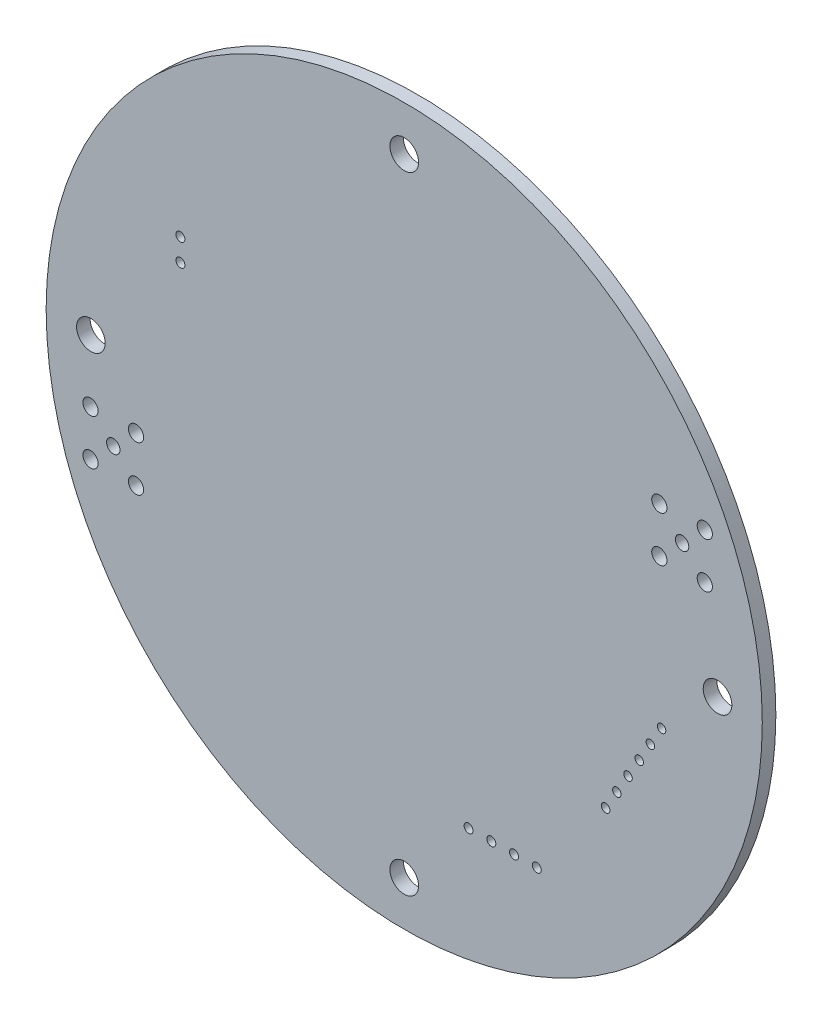
ISO-10303-21;
HEADER;
FILE_DESCRIPTION(('STEP AP214'),'2;1');
FILE_NAME('part.step','',(''),(''),'','','');
FILE_SCHEMA(('AUTOMOTIVE_DESIGN { 1 0 10303 214 1 1 1 1 }'));
ENDSEC;
DATA;
#1=APPLICATION_CONTEXT('core data for automotive mechanical design processes');
#2=APPLICATION_PROTOCOL_DEFINITION('international standard','automotive_design',2000,#1);
#3=PRODUCT_CONTEXT('',#1,'mechanical');
#4=PRODUCT('Part','Part','',(#3));
#5=PRODUCT_RELATED_PRODUCT_CATEGORY('part','',(#4));
#6=PRODUCT_DEFINITION_FORMATION('','',#4);
#7=PRODUCT_DEFINITION_CONTEXT('part definition',#1,'design');
#8=PRODUCT_DEFINITION('design','',#6,#7);
#9=PRODUCT_DEFINITION_SHAPE('','',#8);
#10=(LENGTH_UNIT() NAMED_UNIT(*) SI_UNIT(.MILLI.,.METRE.));
#11=(NAMED_UNIT(*) PLANE_ANGLE_UNIT() SI_UNIT($,.RADIAN.));
#12=(NAMED_UNIT(*) SI_UNIT($,.STERADIAN.) SOLID_ANGLE_UNIT());
#13=UNCERTAINTY_MEASURE_WITH_UNIT(LENGTH_MEASURE(1.E-05),#10,'distance_accuracy_value','');
#14=(GEOMETRIC_REPRESENTATION_CONTEXT(3) GLOBAL_UNCERTAINTY_ASSIGNED_CONTEXT((#13)) GLOBAL_UNIT_ASSIGNED_CONTEXT((#10,
#11,#12)) REPRESENTATION_CONTEXT('',''));
#15=CARTESIAN_POINT('',(0.,0.,0.));
#16=DIRECTION('',(0.,0.,1.));
#17=DIRECTION('',(1.,0.,0.));
#18=AXIS2_PLACEMENT_3D('',#15,#16,#17);
#19=CARTESIAN_POINT('',(0.,0.,1.5162));
#20=DIRECTION('',(0.,0.,1.));
#21=DIRECTION('',(1.,0.,0.));
#22=AXIS2_PLACEMENT_3D('',#19,#20,#21);
#23=PLANE('',#22);
#24=CARTESIAN_POINT('',(180.578422,-80.56,1.5162));
#25=DIRECTION('',(0.,0.,-1.));
#26=DIRECTION('',(-1.,0.,0.));
#27=AXIS2_PLACEMENT_3D('',#24,#25,#26);
#28=CIRCLE('',#27,0.85);
#29=CARTESIAN_POINT('',(179.728422,-80.56,1.5162));
#30=VERTEX_POINT('',#29);
#31=EDGE_CURVE('E104',#30,#30,#28,.T.);
#32=ORIENTED_EDGE('',*,*,#31,.T.);
#33=EDGE_LOOP('',(#32));
#34=FACE_BOUND('',#33,.T.);
#35=CARTESIAN_POINT('',(175.498422,-80.56,1.5162));
#36=DIRECTION('',(0.,0.,-1.));
#37=DIRECTION('',(-1.,0.,0.));
#38=AXIS2_PLACEMENT_3D('',#35,#36,#37);
#39=CIRCLE('',#38,0.85);
#40=CARTESIAN_POINT('',(174.648422,-80.56,1.5162));
#41=VERTEX_POINT('',#40);
#42=EDGE_CURVE('E107',#41,#41,#39,.T.);
#43=ORIENTED_EDGE('',*,*,#42,.T.);
#44=EDGE_LOOP('',(#43));
#45=FACE_BOUND('',#44,.T.);
#46=CARTESIAN_POINT('',(180.578422,-85.64,1.5162));
#47=DIRECTION('',(0.,0.,-1.));
#48=DIRECTION('',(-1.,0.,0.));
#49=AXIS2_PLACEMENT_3D('',#46,#47,#48);
#50=CIRCLE('',#49,0.85);
#51=CARTESIAN_POINT('',(179.728422,-85.64,1.5162));
#52=VERTEX_POINT('',#51);
#53=EDGE_CURVE('E110',#52,#52,#50,.T.);
#54=ORIENTED_EDGE('',*,*,#53,.T.);
#55=EDGE_LOOP('',(#54));
#56=FACE_BOUND('',#55,.T.);
#57=CARTESIAN_POINT('',(178.038422,-83.1,1.5162));
#58=DIRECTION('',(0.,0.,-1.));
#59=DIRECTION('',(-1.,0.,0.));
#60=AXIS2_PLACEMENT_3D('',#57,#58,#59);
#61=CIRCLE('',#60,0.75);
#62=CARTESIAN_POINT('',(177.288422,-83.1,1.5162));
#63=VERTEX_POINT('',#62);
#64=EDGE_CURVE('E113',#63,#63,#61,.T.);
#65=ORIENTED_EDGE('',*,*,#64,.T.);
#66=EDGE_LOOP('',(#65));
#67=FACE_BOUND('',#66,.T.);
#68=CARTESIAN_POINT('',(175.498422,-85.64,1.5162));
#69=DIRECTION('',(0.,0.,-1.));
#70=DIRECTION('',(-1.,0.,0.));
#71=AXIS2_PLACEMENT_3D('',#68,#69,#70);
#72=CIRCLE('',#71,0.85);
#73=CARTESIAN_POINT('',(174.648422,-85.64,1.5162));
#74=VERTEX_POINT('',#73);
#75=EDGE_CURVE('E116',#74,#74,#72,.T.);
#76=ORIENTED_EDGE('',*,*,#75,.T.);
#77=EDGE_LOOP('',(#76));
#78=FACE_BOUND('',#77,.T.);
#79=CARTESIAN_POINT('',(182.,-96.,1.5162));
#80=DIRECTION('',(0.,0.,-1.));
#81=DIRECTION('',(-1.,0.,0.));
#82=AXIS2_PLACEMENT_3D('',#79,#80,#81);
#83=CIRCLE('',#82,1.6);
#84=CARTESIAN_POINT('',(180.4,-96.,1.5162));
#85=VERTEX_POINT('',#84);
#86=EDGE_CURVE('E119',#85,#85,#83,.T.);
#87=ORIENTED_EDGE('',*,*,#86,.T.);
#88=EDGE_LOOP('',(#87));
#89=FACE_BOUND('',#88,.T.);
#90=CARTESIAN_POINT('',(147.,-61.,1.5162));
#91=DIRECTION('',(0.,0.,-1.));
#92=DIRECTION('',(-1.,0.,0.));
#93=AXIS2_PLACEMENT_3D('',#90,#91,#92);
#94=CIRCLE('',#93,1.6);
#95=CARTESIAN_POINT('',(145.4,-61.,1.5162));
#96=VERTEX_POINT('',#95);
#97=EDGE_CURVE('E122',#96,#96,#94,.T.);
#98=ORIENTED_EDGE('',*,*,#97,.T.);
#99=EDGE_LOOP('',(#98));
#100=FACE_BOUND('',#99,.T.);
#101=CARTESIAN_POINT('',(122.,-81.5,1.5162));
#102=DIRECTION('',(0.,0.,-1.));
#103=DIRECTION('',(-1.,0.,0.));
#104=AXIS2_PLACEMENT_3D('',#101,#102,#103);
#105=CIRCLE('',#104,0.5);
#106=CARTESIAN_POINT('',(121.5,-81.5,1.5162));
#107=VERTEX_POINT('',#106);
#108=EDGE_CURVE('E125',#107,#107,#105,.T.);
#109=ORIENTED_EDGE('',*,*,#108,.T.);
#110=EDGE_LOOP('',(#109));
#111=FACE_BOUND('',#110,.T.);
#112=CARTESIAN_POINT('',(122.,-84.,1.5162));
#113=DIRECTION('',(0.,0.,-1.));
#114=DIRECTION('',(-1.,0.,0.));
#115=AXIS2_PLACEMENT_3D('',#112,#113,#114);
#116=CIRCLE('',#115,0.5);
#117=CARTESIAN_POINT('',(121.5,-84.,1.5162));
#118=VERTEX_POINT('',#117);
#119=EDGE_CURVE('E128',#118,#118,#116,.T.);
#120=ORIENTED_EDGE('',*,*,#119,.T.);
#121=EDGE_LOOP('',(#120));
#122=FACE_BOUND('',#121,.T.);
#123=CARTESIAN_POINT('',(175.75,-102.174682,1.5162));
#124=DIRECTION('',(0.,0.,-1.));
#125=DIRECTION('',(-1.,0.,0.));
#126=AXIS2_PLACEMENT_3D('',#123,#124,#125);
#127=CIRCLE('',#126,0.475);
#128=CARTESIAN_POINT('',(175.275,-102.174682,1.5162));
#129=VERTEX_POINT('',#128);
#130=EDGE_CURVE('E131',#129,#129,#127,.T.);
#131=ORIENTED_EDGE('',*,*,#130,.T.);
#132=EDGE_LOOP('',(#131));
#133=FACE_BOUND('',#132,.T.);
#134=CARTESIAN_POINT('',(174.5,-104.339746,1.5162));
#135=DIRECTION('',(0.,0.,-1.));
#136=DIRECTION('',(-1.,0.,0.));
#137=AXIS2_PLACEMENT_3D('',#134,#135,#136);
#138=CIRCLE('',#137,0.475);
#139=CARTESIAN_POINT('',(174.025,-104.339746,1.5162));
#140=VERTEX_POINT('',#139);
#141=EDGE_CURVE('E134',#140,#140,#138,.T.);
#142=ORIENTED_EDGE('',*,*,#141,.T.);
#143=EDGE_LOOP('',(#142));
#144=FACE_BOUND('',#143,.T.);
#145=CARTESIAN_POINT('',(173.25,-106.504809,1.5162));
#146=DIRECTION('',(0.,0.,-1.));
#147=DIRECTION('',(-1.,0.,0.));
#148=AXIS2_PLACEMENT_3D('',#145,#146,#147);
#149=CIRCLE('',#148,0.475);
#150=CARTESIAN_POINT('',(172.775,-106.504809,1.5162));
#151=VERTEX_POINT('',#150);
#152=EDGE_CURVE('E137',#151,#151,#149,.T.);
#153=ORIENTED_EDGE('',*,*,#152,.T.);
#154=EDGE_LOOP('',(#153));
#155=FACE_BOUND('',#154,.T.);
#156=CARTESIAN_POINT('',(172.,-108.669873,1.5162));
#157=DIRECTION('',(0.,0.,-1.));
#158=DIRECTION('',(-1.,0.,0.));
#159=AXIS2_PLACEMENT_3D('',#156,#157,#158);
#160=CIRCLE('',#159,0.475);
#161=CARTESIAN_POINT('',(171.525,-108.669873,1.5162));
#162=VERTEX_POINT('',#161);
#163=EDGE_CURVE('E140',#162,#162,#160,.T.);
#164=ORIENTED_EDGE('',*,*,#163,.T.);
#165=EDGE_LOOP('',(#164));
#166=FACE_BOUND('',#165,.T.);
#167=CARTESIAN_POINT('',(170.75,-110.834936,1.5162));
#168=DIRECTION('',(0.,0.,-1.));
#169=DIRECTION('',(-1.,0.,0.));
#170=AXIS2_PLACEMENT_3D('',#167,#168,#169);
#171=CIRCLE('',#170,0.475);
#172=CARTESIAN_POINT('',(170.275,-110.834936,1.5162));
#173=VERTEX_POINT('',#172);
#174=EDGE_CURVE('E143',#173,#173,#171,.T.);
#175=ORIENTED_EDGE('',*,*,#174,.T.);
#176=EDGE_LOOP('',(#175));
#177=FACE_BOUND('',#176,.T.);
#178=CARTESIAN_POINT('',(169.5,-113.,1.5162));
#179=DIRECTION('',(0.,0.,-1.));
#180=DIRECTION('',(-1.,0.,0.));
#181=AXIS2_PLACEMENT_3D('',#178,#179,#180);
#182=CIRCLE('',#181,0.475);
#183=CARTESIAN_POINT('',(169.025,-113.,1.5162));
#184=VERTEX_POINT('',#183);
#185=EDGE_CURVE('E146',#184,#184,#182,.T.);
#186=ORIENTED_EDGE('',*,*,#185,.T.);
#187=EDGE_LOOP('',(#186));
#188=FACE_BOUND('',#187,.T.);
#189=CARTESIAN_POINT('',(161.81,-122.615,1.5162));
#190=DIRECTION('',(0.,0.,-1.));
#191=DIRECTION('',(-1.,0.,0.));
#192=AXIS2_PLACEMENT_3D('',#189,#190,#191);
#193=CIRCLE('',#192,0.5);
#194=CARTESIAN_POINT('',(161.31,-122.615,1.5162));
#195=VERTEX_POINT('',#194);
#196=EDGE_CURVE('E149',#195,#195,#193,.T.);
#197=ORIENTED_EDGE('',*,*,#196,.T.);
#198=EDGE_LOOP('',(#197));
#199=FACE_BOUND('',#198,.T.);
#200=CARTESIAN_POINT('',(159.27,-122.615,1.5162));
#201=DIRECTION('',(0.,0.,-1.));
#202=DIRECTION('',(-1.,0.,0.));
#203=AXIS2_PLACEMENT_3D('',#200,#201,#202);
#204=CIRCLE('',#203,0.5);
#205=CARTESIAN_POINT('',(158.77,-122.615,1.5162));
#206=VERTEX_POINT('',#205);
#207=EDGE_CURVE('E152',#206,#206,#204,.T.);
#208=ORIENTED_EDGE('',*,*,#207,.T.);
#209=EDGE_LOOP('',(#208));
#210=FACE_BOUND('',#209,.T.);
#211=CARTESIAN_POINT('',(156.73,-122.615,1.5162));
#212=DIRECTION('',(0.,0.,-1.));
#213=DIRECTION('',(-1.,0.,0.));
#214=AXIS2_PLACEMENT_3D('',#211,#212,#213);
#215=CIRCLE('',#214,0.5);
#216=CARTESIAN_POINT('',(156.23,-122.615,1.5162));
#217=VERTEX_POINT('',#216);
#218=EDGE_CURVE('E155',#217,#217,#215,.T.);
#219=ORIENTED_EDGE('',*,*,#218,.T.);
#220=EDGE_LOOP('',(#219));
#221=FACE_BOUND('',#220,.T.);
#222=CARTESIAN_POINT('',(154.19,-122.615,1.5162));
#223=DIRECTION('',(0.,0.,-1.));
#224=DIRECTION('',(-1.,0.,0.));
#225=AXIS2_PLACEMENT_3D('',#222,#223,#224);
#226=CIRCLE('',#225,0.5);
#227=CARTESIAN_POINT('',(153.69,-122.615,1.5162));
#228=VERTEX_POINT('',#227);
#229=EDGE_CURVE('E158',#228,#228,#226,.T.);
#230=ORIENTED_EDGE('',*,*,#229,.T.);
#231=EDGE_LOOP('',(#230));
#232=FACE_BOUND('',#231,.T.);
#233=CARTESIAN_POINT('',(112.,-96.,1.5162));
#234=DIRECTION('',(0.,0.,-1.));
#235=DIRECTION('',(-1.,0.,0.));
#236=AXIS2_PLACEMENT_3D('',#233,#234,#235);
#237=CIRCLE('',#236,1.6);
#238=CARTESIAN_POINT('',(110.4,-96.,1.5162));
#239=VERTEX_POINT('',#238);
#240=EDGE_CURVE('E161',#239,#239,#237,.T.);
#241=ORIENTED_EDGE('',*,*,#240,.T.);
#242=EDGE_LOOP('',(#241));
#243=FACE_BOUND('',#242,.T.);
#244=CARTESIAN_POINT('',(117.04,-102.96,1.5162));
#245=DIRECTION('',(0.,0.,-1.));
#246=DIRECTION('',(-1.,0.,0.));
#247=AXIS2_PLACEMENT_3D('',#244,#245,#246);
#248=CIRCLE('',#247,0.85);
#249=CARTESIAN_POINT('',(116.19,-102.96,1.5162));
#250=VERTEX_POINT('',#249);
#251=EDGE_CURVE('E164',#250,#250,#248,.T.);
#252=ORIENTED_EDGE('',*,*,#251,.T.);
#253=EDGE_LOOP('',(#252));
#254=FACE_BOUND('',#253,.T.);
#255=CARTESIAN_POINT('',(111.96,-102.96,1.5162));
#256=DIRECTION('',(0.,0.,-1.));
#257=DIRECTION('',(-1.,0.,0.));
#258=AXIS2_PLACEMENT_3D('',#255,#256,#257);
#259=CIRCLE('',#258,0.85);
#260=CARTESIAN_POINT('',(111.11,-102.96,1.5162));
#261=VERTEX_POINT('',#260);
#262=EDGE_CURVE('E167',#261,#261,#259,.T.);
#263=ORIENTED_EDGE('',*,*,#262,.T.);
#264=EDGE_LOOP('',(#263));
#265=FACE_BOUND('',#264,.T.);
#266=CARTESIAN_POINT('',(117.04,-108.04,1.5162));
#267=DIRECTION('',(0.,0.,-1.));
#268=DIRECTION('',(-1.,0.,0.));
#269=AXIS2_PLACEMENT_3D('',#266,#267,#268);
#270=CIRCLE('',#269,0.85);
#271=CARTESIAN_POINT('',(116.19,-108.04,1.5162));
#272=VERTEX_POINT('',#271);
#273=EDGE_CURVE('E170',#272,#272,#270,.T.);
#274=ORIENTED_EDGE('',*,*,#273,.T.);
#275=EDGE_LOOP('',(#274));
#276=FACE_BOUND('',#275,.T.);
#277=CARTESIAN_POINT('',(114.5,-105.5,1.5162));
#278=DIRECTION('',(0.,0.,-1.));
#279=DIRECTION('',(-1.,0.,0.));
#280=AXIS2_PLACEMENT_3D('',#277,#278,#279);
#281=CIRCLE('',#280,0.75);
#282=CARTESIAN_POINT('',(113.75,-105.5,1.5162));
#283=VERTEX_POINT('',#282);
#284=EDGE_CURVE('E173',#283,#283,#281,.T.);
#285=ORIENTED_EDGE('',*,*,#284,.T.);
#286=EDGE_LOOP('',(#285));
#287=FACE_BOUND('',#286,.T.);
#288=CARTESIAN_POINT('',(111.96,-108.04,1.5162));
#289=DIRECTION('',(0.,0.,-1.));
#290=DIRECTION('',(-1.,0.,0.));
#291=AXIS2_PLACEMENT_3D('',#288,#289,#290);
#292=CIRCLE('',#291,0.85);
#293=CARTESIAN_POINT('',(111.11,-108.04,1.5162));
#294=VERTEX_POINT('',#293);
#295=EDGE_CURVE('E176',#294,#294,#292,.T.);
#296=ORIENTED_EDGE('',*,*,#295,.T.);
#297=EDGE_LOOP('',(#296));
#298=FACE_BOUND('',#297,.T.);
#299=CARTESIAN_POINT('',(147.,-131.,1.5162));
#300=DIRECTION('',(0.,0.,-1.));
#301=DIRECTION('',(-1.,0.,0.));
#302=AXIS2_PLACEMENT_3D('',#299,#300,#301);
#303=CIRCLE('',#302,1.6);
#304=CARTESIAN_POINT('',(145.4,-131.,1.5162));
#305=VERTEX_POINT('',#304);
#306=EDGE_CURVE('E178',#305,#305,#303,.T.);
#307=ORIENTED_EDGE('',*,*,#306,.T.);
#308=EDGE_LOOP('',(#307));
#309=FACE_BOUND('',#308,.T.);
#310=CARTESIAN_POINT('',(147.,-96.,1.5162));
#311=DIRECTION('',(0.,0.,-1.));
#312=DIRECTION('',(-1.,0.,0.));
#313=AXIS2_PLACEMENT_3D('',#310,#311,#312);
#314=CIRCLE('',#313,40.);
#315=CARTESIAN_POINT('',(107.,-96.,1.5162));
#316=VERTEX_POINT('',#315);
#317=EDGE_CURVE('E18',#316,#316,#314,.T.);
#318=ORIENTED_EDGE('',*,*,#317,.F.);
#319=EDGE_LOOP('',(#318));
#320=FACE_BOUND('',#319,.T.);
#321=ADVANCED_FACE('F15',(#34,#45,#56,#67,#78,#89,#100,#111,#122,#133,#144,#155,#166,#177,#188,
#199,#210,#221,#232,#243,#254,#265,#276,#287,#298,#309,#320),#23,.T.);
#322=CARTESIAN_POINT('',(147.,-96.,0.));
#323=DIRECTION('',(0.,0.,-1.));
#324=DIRECTION('',(-1.,0.,0.));
#325=AXIS2_PLACEMENT_3D('',#322,#323,#324);
#326=CYLINDRICAL_SURFACE('',#325,40.);
#327=ORIENTED_EDGE('',*,*,#317,.T.);
#328=EDGE_LOOP('',(#327));
#329=FACE_BOUND('',#328,.T.);
#330=CARTESIAN_POINT('',(147.,-96.,0.));
#331=DIRECTION('',(0.,0.,-1.));
#332=DIRECTION('',(-1.,0.,0.));
#333=AXIS2_PLACEMENT_3D('',#330,#331,#332);
#334=CIRCLE('',#333,40.);
#335=CARTESIAN_POINT('',(107.,-96.,0.));
#336=VERTEX_POINT('',#335);
#337=EDGE_CURVE('E101',#336,#336,#334,.F.);
#338=ORIENTED_EDGE('',*,*,#337,.T.);
#339=EDGE_LOOP('',(#338));
#340=FACE_BOUND('',#339,.T.);
#341=ADVANCED_FACE('F185',(#329,#340),#326,.T.);
#342=CARTESIAN_POINT('',(147.,-131.,-0.046));
#343=DIRECTION('',(0.,0.,-1.));
#344=DIRECTION('',(-1.,0.,0.));
#345=AXIS2_PLACEMENT_3D('',#342,#343,#344);
#346=CYLINDRICAL_SURFACE('',#345,1.6);
#347=ORIENTED_EDGE('',*,*,#306,.F.);
#348=EDGE_LOOP('',(#347));
#349=FACE_BOUND('',#348,.T.);
#350=CARTESIAN_POINT('',(147.,-131.,0.));
#351=DIRECTION('',(0.,0.,-1.));
#352=DIRECTION('',(-1.,0.,0.));
#353=AXIS2_PLACEMENT_3D('',#350,#351,#352);
#354=CIRCLE('',#353,1.6);
#355=CARTESIAN_POINT('',(145.4,-131.,0.));
#356=VERTEX_POINT('',#355);
#357=EDGE_CURVE('E98',#356,#356,#354,.T.);
#358=ORIENTED_EDGE('',*,*,#357,.T.);
#359=EDGE_LOOP('',(#358));
#360=FACE_BOUND('',#359,.T.);
#361=ADVANCED_FACE('F194',(#349,#360),#346,.F.);
#362=CARTESIAN_POINT('',(111.96,-108.04,-0.046));
#363=DIRECTION('',(0.,0.,-1.));
#364=DIRECTION('',(-1.,0.,0.));
#365=AXIS2_PLACEMENT_3D('',#362,#363,#364);
#366=CYLINDRICAL_SURFACE('',#365,0.85);
#367=ORIENTED_EDGE('',*,*,#295,.F.);
#368=EDGE_LOOP('',(#367));
#369=FACE_BOUND('',#368,.T.);
#370=CARTESIAN_POINT('',(111.96,-108.04,0.));
#371=DIRECTION('',(0.,0.,-1.));
#372=DIRECTION('',(-1.,0.,0.));
#373=AXIS2_PLACEMENT_3D('',#370,#371,#372);
#374=CIRCLE('',#373,0.85);
#375=CARTESIAN_POINT('',(111.11,-108.04,0.));
#376=VERTEX_POINT('',#375);
#377=EDGE_CURVE('E95',#376,#376,#374,.T.);
#378=ORIENTED_EDGE('',*,*,#377,.T.);
#379=EDGE_LOOP('',(#378));
#380=FACE_BOUND('',#379,.T.);
#381=ADVANCED_FACE('F299',(#369,#380),#366,.F.);
#382=CARTESIAN_POINT('',(114.5,-105.5,-0.046));
#383=DIRECTION('',(0.,0.,-1.));
#384=DIRECTION('',(-1.,0.,0.));
#385=AXIS2_PLACEMENT_3D('',#382,#383,#384);
#386=CYLINDRICAL_SURFACE('',#385,0.75);
#387=ORIENTED_EDGE('',*,*,#284,.F.);
#388=EDGE_LOOP('',(#387));
#389=FACE_BOUND('',#388,.T.);
#390=CARTESIAN_POINT('',(114.5,-105.5,0.));
#391=DIRECTION('',(0.,0.,-1.));
#392=DIRECTION('',(-1.,0.,0.));
#393=AXIS2_PLACEMENT_3D('',#390,#391,#392);
#394=CIRCLE('',#393,0.75);
#395=CARTESIAN_POINT('',(113.75,-105.5,0.));
#396=VERTEX_POINT('',#395);
#397=EDGE_CURVE('E92',#396,#396,#394,.T.);
#398=ORIENTED_EDGE('',*,*,#397,.T.);
#399=EDGE_LOOP('',(#398));
#400=FACE_BOUND('',#399,.T.);
#401=ADVANCED_FACE('F295',(#389,#400),#386,.F.);
#402=CARTESIAN_POINT('',(117.04,-108.04,-0.046));
#403=DIRECTION('',(0.,0.,-1.));
#404=DIRECTION('',(-1.,0.,0.));
#405=AXIS2_PLACEMENT_3D('',#402,#403,#404);
#406=CYLINDRICAL_SURFACE('',#405,0.85);
#407=ORIENTED_EDGE('',*,*,#273,.F.);
#408=EDGE_LOOP('',(#407));
#409=FACE_BOUND('',#408,.T.);
#410=CARTESIAN_POINT('',(117.04,-108.04,0.));
#411=DIRECTION('',(0.,0.,-1.));
#412=DIRECTION('',(-1.,0.,0.));
#413=AXIS2_PLACEMENT_3D('',#410,#411,#412);
#414=CIRCLE('',#413,0.85);
#415=CARTESIAN_POINT('',(116.19,-108.04,0.));
#416=VERTEX_POINT('',#415);
#417=EDGE_CURVE('E89',#416,#416,#414,.T.);
#418=ORIENTED_EDGE('',*,*,#417,.T.);
#419=EDGE_LOOP('',(#418));
#420=FACE_BOUND('',#419,.T.);
#421=ADVANCED_FACE('F291',(#409,#420),#406,.F.);
#422=CARTESIAN_POINT('',(111.96,-102.96,-0.046));
#423=DIRECTION('',(0.,0.,-1.));
#424=DIRECTION('',(-1.,0.,0.));
#425=AXIS2_PLACEMENT_3D('',#422,#423,#424);
#426=CYLINDRICAL_SURFACE('',#425,0.85);
#427=ORIENTED_EDGE('',*,*,#262,.F.);
#428=EDGE_LOOP('',(#427));
#429=FACE_BOUND('',#428,.T.);
#430=CARTESIAN_POINT('',(111.96,-102.96,0.));
#431=DIRECTION('',(0.,0.,-1.));
#432=DIRECTION('',(-1.,0.,0.));
#433=AXIS2_PLACEMENT_3D('',#430,#431,#432);
#434=CIRCLE('',#433,0.85);
#435=CARTESIAN_POINT('',(111.11,-102.96,0.));
#436=VERTEX_POINT('',#435);
#437=EDGE_CURVE('E86',#436,#436,#434,.T.);
#438=ORIENTED_EDGE('',*,*,#437,.T.);
#439=EDGE_LOOP('',(#438));
#440=FACE_BOUND('',#439,.T.);
#441=ADVANCED_FACE('F287',(#429,#440),#426,.F.);
#442=CARTESIAN_POINT('',(117.04,-102.96,-0.046));
#443=DIRECTION('',(0.,0.,-1.));
#444=DIRECTION('',(-1.,0.,0.));
#445=AXIS2_PLACEMENT_3D('',#442,#443,#444);
#446=CYLINDRICAL_SURFACE('',#445,0.85);
#447=ORIENTED_EDGE('',*,*,#251,.F.);
#448=EDGE_LOOP('',(#447));
#449=FACE_BOUND('',#448,.T.);
#450=CARTESIAN_POINT('',(117.04,-102.96,0.));
#451=DIRECTION('',(0.,0.,-1.));
#452=DIRECTION('',(-1.,0.,0.));
#453=AXIS2_PLACEMENT_3D('',#450,#451,#452);
#454=CIRCLE('',#453,0.85);
#455=CARTESIAN_POINT('',(116.19,-102.96,0.));
#456=VERTEX_POINT('',#455);
#457=EDGE_CURVE('E83',#456,#456,#454,.T.);
#458=ORIENTED_EDGE('',*,*,#457,.T.);
#459=EDGE_LOOP('',(#458));
#460=FACE_BOUND('',#459,.T.);
#461=ADVANCED_FACE('F283',(#449,#460),#446,.F.);
#462=CARTESIAN_POINT('',(112.,-96.,-0.046));
#463=DIRECTION('',(0.,0.,-1.));
#464=DIRECTION('',(-1.,0.,0.));
#465=AXIS2_PLACEMENT_3D('',#462,#463,#464);
#466=CYLINDRICAL_SURFACE('',#465,1.6);
#467=ORIENTED_EDGE('',*,*,#240,.F.);
#468=EDGE_LOOP('',(#467));
#469=FACE_BOUND('',#468,.T.);
#470=CARTESIAN_POINT('',(112.,-96.,0.));
#471=DIRECTION('',(0.,0.,-1.));
#472=DIRECTION('',(-1.,0.,0.));
#473=AXIS2_PLACEMENT_3D('',#470,#471,#472);
#474=CIRCLE('',#473,1.6);
#475=CARTESIAN_POINT('',(110.4,-96.,0.));
#476=VERTEX_POINT('',#475);
#477=EDGE_CURVE('E80',#476,#476,#474,.T.);
#478=ORIENTED_EDGE('',*,*,#477,.T.);
#479=EDGE_LOOP('',(#478));
#480=FACE_BOUND('',#479,.T.);
#481=ADVANCED_FACE('F279',(#469,#480),#466,.F.);
#482=CARTESIAN_POINT('',(154.19,-122.615,-0.046));
#483=DIRECTION('',(0.,0.,-1.));
#484=DIRECTION('',(-1.,0.,0.));
#485=AXIS2_PLACEMENT_3D('',#482,#483,#484);
#486=CYLINDRICAL_SURFACE('',#485,0.5);
#487=ORIENTED_EDGE('',*,*,#229,.F.);
#488=EDGE_LOOP('',(#487));
#489=FACE_BOUND('',#488,.T.);
#490=CARTESIAN_POINT('',(154.19,-122.615,0.));
#491=DIRECTION('',(0.,0.,-1.));
#492=DIRECTION('',(-1.,0.,0.));
#493=AXIS2_PLACEMENT_3D('',#490,#491,#492);
#494=CIRCLE('',#493,0.5);
#495=CARTESIAN_POINT('',(153.69,-122.615,0.));
#496=VERTEX_POINT('',#495);
#497=EDGE_CURVE('E77',#496,#496,#494,.T.);
#498=ORIENTED_EDGE('',*,*,#497,.T.);
#499=EDGE_LOOP('',(#498));
#500=FACE_BOUND('',#499,.T.);
#501=ADVANCED_FACE('F275',(#489,#500),#486,.F.);
#502=CARTESIAN_POINT('',(156.73,-122.615,-0.046));
#503=DIRECTION('',(0.,0.,-1.));
#504=DIRECTION('',(-1.,0.,0.));
#505=AXIS2_PLACEMENT_3D('',#502,#503,#504);
#506=CYLINDRICAL_SURFACE('',#505,0.5);
#507=ORIENTED_EDGE('',*,*,#218,.F.);
#508=EDGE_LOOP('',(#507));
#509=FACE_BOUND('',#508,.T.);
#510=CARTESIAN_POINT('',(156.73,-122.615,0.));
#511=DIRECTION('',(0.,0.,-1.));
#512=DIRECTION('',(-1.,0.,0.));
#513=AXIS2_PLACEMENT_3D('',#510,#511,#512);
#514=CIRCLE('',#513,0.5);
#515=CARTESIAN_POINT('',(156.23,-122.615,0.));
#516=VERTEX_POINT('',#515);
#517=EDGE_CURVE('E74',#516,#516,#514,.T.);
#518=ORIENTED_EDGE('',*,*,#517,.T.);
#519=EDGE_LOOP('',(#518));
#520=FACE_BOUND('',#519,.T.);
#521=ADVANCED_FACE('F271',(#509,#520),#506,.F.);
#522=CARTESIAN_POINT('',(159.27,-122.615,-0.046));
#523=DIRECTION('',(0.,0.,-1.));
#524=DIRECTION('',(-1.,0.,0.));
#525=AXIS2_PLACEMENT_3D('',#522,#523,#524);
#526=CYLINDRICAL_SURFACE('',#525,0.5);
#527=ORIENTED_EDGE('',*,*,#207,.F.);
#528=EDGE_LOOP('',(#527));
#529=FACE_BOUND('',#528,.T.);
#530=CARTESIAN_POINT('',(159.27,-122.615,0.));
#531=DIRECTION('',(0.,0.,-1.));
#532=DIRECTION('',(-1.,0.,0.));
#533=AXIS2_PLACEMENT_3D('',#530,#531,#532);
#534=CIRCLE('',#533,0.5);
#535=CARTESIAN_POINT('',(158.77,-122.615,0.));
#536=VERTEX_POINT('',#535);
#537=EDGE_CURVE('E71',#536,#536,#534,.T.);
#538=ORIENTED_EDGE('',*,*,#537,.T.);
#539=EDGE_LOOP('',(#538));
#540=FACE_BOUND('',#539,.T.);
#541=ADVANCED_FACE('F267',(#529,#540),#526,.F.);
#542=CARTESIAN_POINT('',(161.81,-122.615,-0.046));
#543=DIRECTION('',(0.,0.,-1.));
#544=DIRECTION('',(-1.,0.,0.));
#545=AXIS2_PLACEMENT_3D('',#542,#543,#544);
#546=CYLINDRICAL_SURFACE('',#545,0.5);
#547=ORIENTED_EDGE('',*,*,#196,.F.);
#548=EDGE_LOOP('',(#547));
#549=FACE_BOUND('',#548,.T.);
#550=CARTESIAN_POINT('',(161.81,-122.615,0.));
#551=DIRECTION('',(0.,0.,-1.));
#552=DIRECTION('',(-1.,0.,0.));
#553=AXIS2_PLACEMENT_3D('',#550,#551,#552);
#554=CIRCLE('',#553,0.5);
#555=CARTESIAN_POINT('',(161.31,-122.615,0.));
#556=VERTEX_POINT('',#555);
#557=EDGE_CURVE('E68',#556,#556,#554,.T.);
#558=ORIENTED_EDGE('',*,*,#557,.T.);
#559=EDGE_LOOP('',(#558));
#560=FACE_BOUND('',#559,.T.);
#561=ADVANCED_FACE('F263',(#549,#560),#546,.F.);
#562=CARTESIAN_POINT('',(169.5,-113.,-0.046));
#563=DIRECTION('',(0.,0.,-1.));
#564=DIRECTION('',(-1.,0.,0.));
#565=AXIS2_PLACEMENT_3D('',#562,#563,#564);
#566=CYLINDRICAL_SURFACE('',#565,0.475);
#567=ORIENTED_EDGE('',*,*,#185,.F.);
#568=EDGE_LOOP('',(#567));
#569=FACE_BOUND('',#568,.T.);
#570=CARTESIAN_POINT('',(169.5,-113.,0.));
#571=DIRECTION('',(0.,0.,-1.));
#572=DIRECTION('',(-1.,0.,0.));
#573=AXIS2_PLACEMENT_3D('',#570,#571,#572);
#574=CIRCLE('',#573,0.475);
#575=CARTESIAN_POINT('',(169.025,-113.,0.));
#576=VERTEX_POINT('',#575);
#577=EDGE_CURVE('E65',#576,#576,#574,.T.);
#578=ORIENTED_EDGE('',*,*,#577,.T.);
#579=EDGE_LOOP('',(#578));
#580=FACE_BOUND('',#579,.T.);
#581=ADVANCED_FACE('F259',(#569,#580),#566,.F.);
#582=CARTESIAN_POINT('',(170.75,-110.834936,-0.046));
#583=DIRECTION('',(0.,0.,-1.));
#584=DIRECTION('',(-1.,0.,0.));
#585=AXIS2_PLACEMENT_3D('',#582,#583,#584);
#586=CYLINDRICAL_SURFACE('',#585,0.475);
#587=ORIENTED_EDGE('',*,*,#174,.F.);
#588=EDGE_LOOP('',(#587));
#589=FACE_BOUND('',#588,.T.);
#590=CARTESIAN_POINT('',(170.75,-110.834936,0.));
#591=DIRECTION('',(0.,0.,-1.));
#592=DIRECTION('',(-1.,0.,0.));
#593=AXIS2_PLACEMENT_3D('',#590,#591,#592);
#594=CIRCLE('',#593,0.475);
#595=CARTESIAN_POINT('',(170.275,-110.834936,0.));
#596=VERTEX_POINT('',#595);
#597=EDGE_CURVE('E62',#596,#596,#594,.T.);
#598=ORIENTED_EDGE('',*,*,#597,.T.);
#599=EDGE_LOOP('',(#598));
#600=FACE_BOUND('',#599,.T.);
#601=ADVANCED_FACE('F255',(#589,#600),#586,.F.);
#602=CARTESIAN_POINT('',(172.,-108.669873,-0.046));
#603=DIRECTION('',(0.,0.,-1.));
#604=DIRECTION('',(-1.,0.,0.));
#605=AXIS2_PLACEMENT_3D('',#602,#603,#604);
#606=CYLINDRICAL_SURFACE('',#605,0.475);
#607=ORIENTED_EDGE('',*,*,#163,.F.);
#608=EDGE_LOOP('',(#607));
#609=FACE_BOUND('',#608,.T.);
#610=CARTESIAN_POINT('',(172.,-108.669873,0.));
#611=DIRECTION('',(0.,0.,-1.));
#612=DIRECTION('',(-1.,0.,0.));
#613=AXIS2_PLACEMENT_3D('',#610,#611,#612);
#614=CIRCLE('',#613,0.475);
#615=CARTESIAN_POINT('',(171.525,-108.669873,0.));
#616=VERTEX_POINT('',#615);
#617=EDGE_CURVE('E59',#616,#616,#614,.T.);
#618=ORIENTED_EDGE('',*,*,#617,.T.);
#619=EDGE_LOOP('',(#618));
#620=FACE_BOUND('',#619,.T.);
#621=ADVANCED_FACE('F251',(#609,#620),#606,.F.);
#622=CARTESIAN_POINT('',(173.25,-106.504809,-0.046));
#623=DIRECTION('',(0.,0.,-1.));
#624=DIRECTION('',(-1.,0.,0.));
#625=AXIS2_PLACEMENT_3D('',#622,#623,#624);
#626=CYLINDRICAL_SURFACE('',#625,0.475);
#627=ORIENTED_EDGE('',*,*,#152,.F.);
#628=EDGE_LOOP('',(#627));
#629=FACE_BOUND('',#628,.T.);
#630=CARTESIAN_POINT('',(173.25,-106.504809,0.));
#631=DIRECTION('',(0.,0.,-1.));
#632=DIRECTION('',(-1.,0.,0.));
#633=AXIS2_PLACEMENT_3D('',#630,#631,#632);
#634=CIRCLE('',#633,0.475);
#635=CARTESIAN_POINT('',(172.775,-106.504809,0.));
#636=VERTEX_POINT('',#635);
#637=EDGE_CURVE('E56',#636,#636,#634,.T.);
#638=ORIENTED_EDGE('',*,*,#637,.T.);
#639=EDGE_LOOP('',(#638));
#640=FACE_BOUND('',#639,.T.);
#641=ADVANCED_FACE('F247',(#629,#640),#626,.F.);
#642=CARTESIAN_POINT('',(174.5,-104.339746,-0.046));
#643=DIRECTION('',(0.,0.,-1.));
#644=DIRECTION('',(-1.,0.,0.));
#645=AXIS2_PLACEMENT_3D('',#642,#643,#644);
#646=CYLINDRICAL_SURFACE('',#645,0.475);
#647=ORIENTED_EDGE('',*,*,#141,.F.);
#648=EDGE_LOOP('',(#647));
#649=FACE_BOUND('',#648,.T.);
#650=CARTESIAN_POINT('',(174.5,-104.339746,0.));
#651=DIRECTION('',(0.,0.,-1.));
#652=DIRECTION('',(-1.,0.,0.));
#653=AXIS2_PLACEMENT_3D('',#650,#651,#652);
#654=CIRCLE('',#653,0.475);
#655=CARTESIAN_POINT('',(174.025,-104.339746,0.));
#656=VERTEX_POINT('',#655);
#657=EDGE_CURVE('E53',#656,#656,#654,.T.);
#658=ORIENTED_EDGE('',*,*,#657,.T.);
#659=EDGE_LOOP('',(#658));
#660=FACE_BOUND('',#659,.T.);
#661=ADVANCED_FACE('F243',(#649,#660),#646,.F.);
#662=CARTESIAN_POINT('',(175.75,-102.174682,-0.046));
#663=DIRECTION('',(0.,0.,-1.));
#664=DIRECTION('',(-1.,0.,0.));
#665=AXIS2_PLACEMENT_3D('',#662,#663,#664);
#666=CYLINDRICAL_SURFACE('',#665,0.475);
#667=ORIENTED_EDGE('',*,*,#130,.F.);
#668=EDGE_LOOP('',(#667));
#669=FACE_BOUND('',#668,.T.);
#670=CARTESIAN_POINT('',(175.75,-102.174682,0.));
#671=DIRECTION('',(0.,0.,-1.));
#672=DIRECTION('',(-1.,0.,0.));
#673=AXIS2_PLACEMENT_3D('',#670,#671,#672);
#674=CIRCLE('',#673,0.475);
#675=CARTESIAN_POINT('',(175.275,-102.174682,0.));
#676=VERTEX_POINT('',#675);
#677=EDGE_CURVE('E50',#676,#676,#674,.T.);
#678=ORIENTED_EDGE('',*,*,#677,.T.);
#679=EDGE_LOOP('',(#678));
#680=FACE_BOUND('',#679,.T.);
#681=ADVANCED_FACE('F239',(#669,#680),#666,.F.);
#682=CARTESIAN_POINT('',(122.,-84.,-0.046));
#683=DIRECTION('',(0.,0.,-1.));
#684=DIRECTION('',(-1.,0.,0.));
#685=AXIS2_PLACEMENT_3D('',#682,#683,#684);
#686=CYLINDRICAL_SURFACE('',#685,0.5);
#687=ORIENTED_EDGE('',*,*,#119,.F.);
#688=EDGE_LOOP('',(#687));
#689=FACE_BOUND('',#688,.T.);
#690=CARTESIAN_POINT('',(122.,-84.,0.));
#691=DIRECTION('',(0.,0.,-1.));
#692=DIRECTION('',(-1.,0.,0.));
#693=AXIS2_PLACEMENT_3D('',#690,#691,#692);
#694=CIRCLE('',#693,0.5);
#695=CARTESIAN_POINT('',(121.5,-84.,0.));
#696=VERTEX_POINT('',#695);
#697=EDGE_CURVE('E47',#696,#696,#694,.T.);
#698=ORIENTED_EDGE('',*,*,#697,.T.);
#699=EDGE_LOOP('',(#698));
#700=FACE_BOUND('',#699,.T.);
#701=ADVANCED_FACE('F235',(#689,#700),#686,.F.);
#702=CARTESIAN_POINT('',(122.,-81.5,-0.046));
#703=DIRECTION('',(0.,0.,-1.));
#704=DIRECTION('',(-1.,0.,0.));
#705=AXIS2_PLACEMENT_3D('',#702,#703,#704);
#706=CYLINDRICAL_SURFACE('',#705,0.5);
#707=ORIENTED_EDGE('',*,*,#108,.F.);
#708=EDGE_LOOP('',(#707));
#709=FACE_BOUND('',#708,.T.);
#710=CARTESIAN_POINT('',(122.,-81.5,0.));
#711=DIRECTION('',(0.,0.,-1.));
#712=DIRECTION('',(-1.,0.,0.));
#713=AXIS2_PLACEMENT_3D('',#710,#711,#712);
#714=CIRCLE('',#713,0.5);
#715=CARTESIAN_POINT('',(121.5,-81.5,0.));
#716=VERTEX_POINT('',#715);
#717=EDGE_CURVE('E44',#716,#716,#714,.T.);
#718=ORIENTED_EDGE('',*,*,#717,.T.);
#719=EDGE_LOOP('',(#718));
#720=FACE_BOUND('',#719,.T.);
#721=ADVANCED_FACE('F231',(#709,#720),#706,.F.);
#722=CARTESIAN_POINT('',(147.,-61.,-0.046));
#723=DIRECTION('',(0.,0.,-1.));
#724=DIRECTION('',(-1.,0.,0.));
#725=AXIS2_PLACEMENT_3D('',#722,#723,#724);
#726=CYLINDRICAL_SURFACE('',#725,1.6);
#727=ORIENTED_EDGE('',*,*,#97,.F.);
#728=EDGE_LOOP('',(#727));
#729=FACE_BOUND('',#728,.T.);
#730=CARTESIAN_POINT('',(147.,-61.,0.));
#731=DIRECTION('',(0.,0.,-1.));
#732=DIRECTION('',(-1.,0.,0.));
#733=AXIS2_PLACEMENT_3D('',#730,#731,#732);
#734=CIRCLE('',#733,1.6);
#735=CARTESIAN_POINT('',(145.4,-61.,0.));
#736=VERTEX_POINT('',#735);
#737=EDGE_CURVE('E41',#736,#736,#734,.T.);
#738=ORIENTED_EDGE('',*,*,#737,.T.);
#739=EDGE_LOOP('',(#738));
#740=FACE_BOUND('',#739,.T.);
#741=ADVANCED_FACE('F227',(#729,#740),#726,.F.);
#742=CARTESIAN_POINT('',(182.,-96.,-0.046));
#743=DIRECTION('',(0.,0.,-1.));
#744=DIRECTION('',(-1.,0.,0.));
#745=AXIS2_PLACEMENT_3D('',#742,#743,#744);
#746=CYLINDRICAL_SURFACE('',#745,1.6);
#747=ORIENTED_EDGE('',*,*,#86,.F.);
#748=EDGE_LOOP('',(#747));
#749=FACE_BOUND('',#748,.T.);
#750=CARTESIAN_POINT('',(182.,-96.,0.));
#751=DIRECTION('',(0.,0.,-1.));
#752=DIRECTION('',(-1.,0.,0.));
#753=AXIS2_PLACEMENT_3D('',#750,#751,#752);
#754=CIRCLE('',#753,1.6);
#755=CARTESIAN_POINT('',(180.4,-96.,0.));
#756=VERTEX_POINT('',#755);
#757=EDGE_CURVE('E38',#756,#756,#754,.T.);
#758=ORIENTED_EDGE('',*,*,#757,.T.);
#759=EDGE_LOOP('',(#758));
#760=FACE_BOUND('',#759,.T.);
#761=ADVANCED_FACE('F223',(#749,#760),#746,.F.);
#762=CARTESIAN_POINT('',(175.498422,-85.64,-0.046));
#763=DIRECTION('',(0.,0.,-1.));
#764=DIRECTION('',(-1.,0.,0.));
#765=AXIS2_PLACEMENT_3D('',#762,#763,#764);
#766=CYLINDRICAL_SURFACE('',#765,0.85);
#767=ORIENTED_EDGE('',*,*,#75,.F.);
#768=EDGE_LOOP('',(#767));
#769=FACE_BOUND('',#768,.T.);
#770=CARTESIAN_POINT('',(175.498422,-85.64,0.));
#771=DIRECTION('',(0.,0.,-1.));
#772=DIRECTION('',(-1.,0.,0.));
#773=AXIS2_PLACEMENT_3D('',#770,#771,#772);
#774=CIRCLE('',#773,0.85);
#775=CARTESIAN_POINT('',(174.648422,-85.64,0.));
#776=VERTEX_POINT('',#775);
#777=EDGE_CURVE('E35',#776,#776,#774,.T.);
#778=ORIENTED_EDGE('',*,*,#777,.T.);
#779=EDGE_LOOP('',(#778));
#780=FACE_BOUND('',#779,.T.);
#781=ADVANCED_FACE('F219',(#769,#780),#766,.F.);
#782=CARTESIAN_POINT('',(178.038422,-83.1,-0.046));
#783=DIRECTION('',(0.,0.,-1.));
#784=DIRECTION('',(-1.,0.,0.));
#785=AXIS2_PLACEMENT_3D('',#782,#783,#784);
#786=CYLINDRICAL_SURFACE('',#785,0.75);
#787=ORIENTED_EDGE('',*,*,#64,.F.);
#788=EDGE_LOOP('',(#787));
#789=FACE_BOUND('',#788,.T.);
#790=CARTESIAN_POINT('',(178.038422,-83.1,0.));
#791=DIRECTION('',(0.,0.,-1.));
#792=DIRECTION('',(-1.,0.,0.));
#793=AXIS2_PLACEMENT_3D('',#790,#791,#792);
#794=CIRCLE('',#793,0.75);
#795=CARTESIAN_POINT('',(177.288422,-83.1,0.));
#796=VERTEX_POINT('',#795);
#797=EDGE_CURVE('E32',#796,#796,#794,.T.);
#798=ORIENTED_EDGE('',*,*,#797,.T.);
#799=EDGE_LOOP('',(#798));
#800=FACE_BOUND('',#799,.T.);
#801=ADVANCED_FACE('F215',(#789,#800),#786,.F.);
#802=CARTESIAN_POINT('',(180.578422,-85.64,-0.046));
#803=DIRECTION('',(0.,0.,-1.));
#804=DIRECTION('',(-1.,0.,0.));
#805=AXIS2_PLACEMENT_3D('',#802,#803,#804);
#806=CYLINDRICAL_SURFACE('',#805,0.85);
#807=ORIENTED_EDGE('',*,*,#53,.F.);
#808=EDGE_LOOP('',(#807));
#809=FACE_BOUND('',#808,.T.);
#810=CARTESIAN_POINT('',(180.578422,-85.64,0.));
#811=DIRECTION('',(0.,0.,-1.));
#812=DIRECTION('',(-1.,0.,0.));
#813=AXIS2_PLACEMENT_3D('',#810,#811,#812);
#814=CIRCLE('',#813,0.85);
#815=CARTESIAN_POINT('',(179.728422,-85.64,0.));
#816=VERTEX_POINT('',#815);
#817=EDGE_CURVE('E27',#816,#816,#814,.T.);
#818=ORIENTED_EDGE('',*,*,#817,.T.);
#819=EDGE_LOOP('',(#818));
#820=FACE_BOUND('',#819,.T.);
#821=ADVANCED_FACE('F211',(#809,#820),#806,.F.);
#822=CARTESIAN_POINT('',(175.498422,-80.56,-0.046));
#823=DIRECTION('',(0.,0.,-1.));
#824=DIRECTION('',(-1.,0.,0.));
#825=AXIS2_PLACEMENT_3D('',#822,#823,#824);
#826=CYLINDRICAL_SURFACE('',#825,0.85);
#827=ORIENTED_EDGE('',*,*,#42,.F.);
#828=EDGE_LOOP('',(#827));
#829=FACE_BOUND('',#828,.T.);
#830=CARTESIAN_POINT('',(175.498422,-80.56,0.));
#831=DIRECTION('',(0.,0.,-1.));
#832=DIRECTION('',(-1.,0.,0.));
#833=AXIS2_PLACEMENT_3D('',#830,#831,#832);
#834=CIRCLE('',#833,0.85);
#835=CARTESIAN_POINT('',(174.648422,-80.56,0.));
#836=VERTEX_POINT('',#835);
#837=EDGE_CURVE('E22',#836,#836,#834,.T.);
#838=ORIENTED_EDGE('',*,*,#837,.T.);
#839=EDGE_LOOP('',(#838));
#840=FACE_BOUND('',#839,.T.);
#841=ADVANCED_FACE('F204',(#829,#840),#826,.F.);
#842=CARTESIAN_POINT('',(180.578422,-80.56,-0.046));
#843=DIRECTION('',(0.,0.,-1.));
#844=DIRECTION('',(-1.,0.,0.));
#845=AXIS2_PLACEMENT_3D('',#842,#843,#844);
#846=CYLINDRICAL_SURFACE('',#845,0.85);
#847=ORIENTED_EDGE('',*,*,#31,.F.);
#848=EDGE_LOOP('',(#847));
#849=FACE_BOUND('',#848,.T.);
#850=CARTESIAN_POINT('',(180.578422,-80.56,0.));
#851=DIRECTION('',(0.,0.,-1.));
#852=DIRECTION('',(-1.,0.,0.));
#853=AXIS2_PLACEMENT_3D('',#850,#851,#852);
#854=CIRCLE('',#853,0.85);
#855=CARTESIAN_POINT('',(179.728422,-80.56,0.));
#856=VERTEX_POINT('',#855);
#857=EDGE_CURVE('E10',#856,#856,#854,.T.);
#858=ORIENTED_EDGE('',*,*,#857,.T.);
#859=EDGE_LOOP('',(#858));
#860=FACE_BOUND('',#859,.T.);
#861=ADVANCED_FACE('F198',(#849,#860),#846,.F.);
#862=CARTESIAN_POINT('',(0.,0.,0.));
#863=DIRECTION('',(0.,0.,1.));
#864=DIRECTION('',(1.,0.,0.));
#865=AXIS2_PLACEMENT_3D('',#862,#863,#864);
#866=PLANE('',#865);
#867=ORIENTED_EDGE('',*,*,#857,.F.);
#868=EDGE_LOOP('',(#867));
#869=FACE_BOUND('',#868,.T.);
#870=ORIENTED_EDGE('',*,*,#837,.F.);
#871=EDGE_LOOP('',(#870));
#872=FACE_BOUND('',#871,.T.);
#873=ORIENTED_EDGE('',*,*,#817,.F.);
#874=EDGE_LOOP('',(#873));
#875=FACE_BOUND('',#874,.T.);
#876=ORIENTED_EDGE('',*,*,#797,.F.);
#877=EDGE_LOOP('',(#876));
#878=FACE_BOUND('',#877,.T.);
#879=ORIENTED_EDGE('',*,*,#777,.F.);
#880=EDGE_LOOP('',(#879));
#881=FACE_BOUND('',#880,.T.);
#882=ORIENTED_EDGE('',*,*,#757,.F.);
#883=EDGE_LOOP('',(#882));
#884=FACE_BOUND('',#883,.T.);
#885=ORIENTED_EDGE('',*,*,#737,.F.);
#886=EDGE_LOOP('',(#885));
#887=FACE_BOUND('',#886,.T.);
#888=ORIENTED_EDGE('',*,*,#717,.F.);
#889=EDGE_LOOP('',(#888));
#890=FACE_BOUND('',#889,.T.);
#891=ORIENTED_EDGE('',*,*,#697,.F.);
#892=EDGE_LOOP('',(#891));
#893=FACE_BOUND('',#892,.T.);
#894=ORIENTED_EDGE('',*,*,#677,.F.);
#895=EDGE_LOOP('',(#894));
#896=FACE_BOUND('',#895,.T.);
#897=ORIENTED_EDGE('',*,*,#657,.F.);
#898=EDGE_LOOP('',(#897));
#899=FACE_BOUND('',#898,.T.);
#900=ORIENTED_EDGE('',*,*,#637,.F.);
#901=EDGE_LOOP('',(#900));
#902=FACE_BOUND('',#901,.T.);
#903=ORIENTED_EDGE('',*,*,#617,.F.);
#904=EDGE_LOOP('',(#903));
#905=FACE_BOUND('',#904,.T.);
#906=ORIENTED_EDGE('',*,*,#597,.F.);
#907=EDGE_LOOP('',(#906));
#908=FACE_BOUND('',#907,.T.);
#909=ORIENTED_EDGE('',*,*,#577,.F.);
#910=EDGE_LOOP('',(#909));
#911=FACE_BOUND('',#910,.T.);
#912=ORIENTED_EDGE('',*,*,#557,.F.);
#913=EDGE_LOOP('',(#912));
#914=FACE_BOUND('',#913,.T.);
#915=ORIENTED_EDGE('',*,*,#537,.F.);
#916=EDGE_LOOP('',(#915));
#917=FACE_BOUND('',#916,.T.);
#918=ORIENTED_EDGE('',*,*,#517,.F.);
#919=EDGE_LOOP('',(#918));
#920=FACE_BOUND('',#919,.T.);
#921=ORIENTED_EDGE('',*,*,#497,.F.);
#922=EDGE_LOOP('',(#921));
#923=FACE_BOUND('',#922,.T.);
#924=ORIENTED_EDGE('',*,*,#477,.F.);
#925=EDGE_LOOP('',(#924));
#926=FACE_BOUND('',#925,.T.);
#927=ORIENTED_EDGE('',*,*,#457,.F.);
#928=EDGE_LOOP('',(#927));
#929=FACE_BOUND('',#928,.T.);
#930=ORIENTED_EDGE('',*,*,#437,.F.);
#931=EDGE_LOOP('',(#930));
#932=FACE_BOUND('',#931,.T.);
#933=ORIENTED_EDGE('',*,*,#417,.F.);
#934=EDGE_LOOP('',(#933));
#935=FACE_BOUND('',#934,.T.);
#936=ORIENTED_EDGE('',*,*,#397,.F.);
#937=EDGE_LOOP('',(#936));
#938=FACE_BOUND('',#937,.T.);
#939=ORIENTED_EDGE('',*,*,#377,.F.);
#940=EDGE_LOOP('',(#939));
#941=FACE_BOUND('',#940,.T.);
#942=ORIENTED_EDGE('',*,*,#357,.F.);
#943=EDGE_LOOP('',(#942));
#944=FACE_BOUND('',#943,.T.);
#945=ORIENTED_EDGE('',*,*,#337,.F.);
#946=EDGE_LOOP('',(#945));
#947=FACE_BOUND('',#946,.T.);
#948=ADVANCED_FACE('F196',(#869,#872,#875,#878,#881,#884,#887,#890,#893,#896,#899,#902,#905,
#908,#911,#914,#917,#920,#923,#926,#929,#932,#935,#938,#941,#944,#947),#866,.F.);
#949=CLOSED_SHELL('',(#321,#341,#361,#381,#401,#421,#441,#461,#481,#501,#521,#541,#561,#581,
#601,#621,#641,#661,#681,#701,#721,#741,#761,#781,#801,#821,#841,#861,#948));
#950=MANIFOLD_SOLID_BREP('B1',#949);
#951=ADVANCED_BREP_SHAPE_REPRESENTATION('',(#18,#950),#14);
#952=SHAPE_DEFINITION_REPRESENTATION(#9,#951);
ENDSEC;
END-ISO-10303-21;
